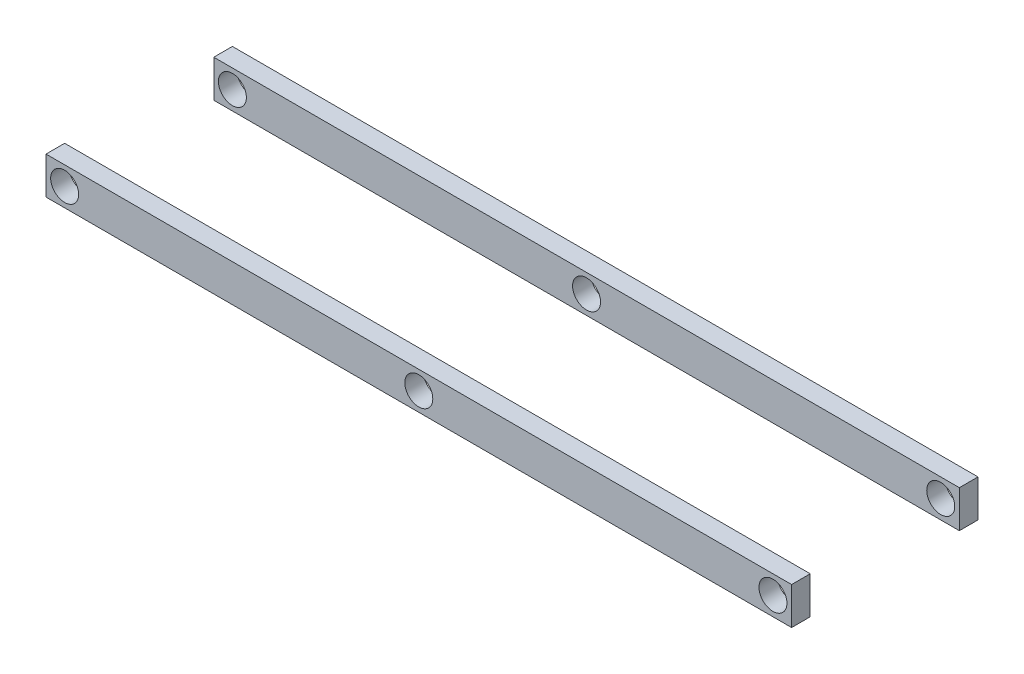
ISO-10303-21;
HEADER;
FILE_DESCRIPTION(('STEP AP214'),'2;1');
FILE_NAME('part.step','',(''),(''),'','','');
FILE_SCHEMA(('AUTOMOTIVE_DESIGN { 1 0 10303 214 1 1 1 1 }'));
ENDSEC;
DATA;
#1=APPLICATION_CONTEXT('core data for automotive mechanical design processes');
#2=APPLICATION_PROTOCOL_DEFINITION('international standard','automotive_design',2000,#1);
#3=PRODUCT_CONTEXT('',#1,'mechanical');
#4=PRODUCT('Part','Part','',(#3));
#5=PRODUCT_RELATED_PRODUCT_CATEGORY('part','',(#4));
#6=PRODUCT_DEFINITION_FORMATION('','',#4);
#7=PRODUCT_DEFINITION_CONTEXT('part definition',#1,'design');
#8=PRODUCT_DEFINITION('design','',#6,#7);
#9=PRODUCT_DEFINITION_SHAPE('','',#8);
#10=(LENGTH_UNIT() NAMED_UNIT(*) SI_UNIT(.MILLI.,.METRE.));
#11=(NAMED_UNIT(*) PLANE_ANGLE_UNIT() SI_UNIT($,.RADIAN.));
#12=(NAMED_UNIT(*) SI_UNIT($,.STERADIAN.) SOLID_ANGLE_UNIT());
#13=UNCERTAINTY_MEASURE_WITH_UNIT(LENGTH_MEASURE(1.E-05),#10,'distance_accuracy_value','');
#14=(GEOMETRIC_REPRESENTATION_CONTEXT(3) GLOBAL_UNCERTAINTY_ASSIGNED_CONTEXT((#13)) GLOBAL_UNIT_ASSIGNED_CONTEXT((#10,
#11,#12)) REPRESENTATION_CONTEXT('',''));
#15=CARTESIAN_POINT('',(0.,0.,0.));
#16=DIRECTION('',(0.,0.,1.));
#17=DIRECTION('',(1.,0.,0.));
#18=AXIS2_PLACEMENT_3D('',#15,#16,#17);
#19=CARTESIAN_POINT('',(0.,2.,0.));
#20=DIRECTION('',(1.,0.,0.));
#21=DIRECTION('',(0.,0.,-1.));
#22=AXIS2_PLACEMENT_3D('',#19,#20,#21);
#23=PLANE('',#22);
#24=DIRECTION('',(0.,0.,1.));
#25=VECTOR('',#24,1.);
#26=CARTESIAN_POINT('',(0.,0.,0.));
#27=LINE('',#26,#25);
#28=CARTESIAN_POINT('',(0.,0.,-10.));
#29=VERTEX_POINT('',#28);
#30=CARTESIAN_POINT('',(0.,0.,-9.));
#31=VERTEX_POINT('',#30);
#32=EDGE_CURVE('E116',#29,#31,#27,.T.);
#33=ORIENTED_EDGE('',*,*,#32,.T.);
#34=DIRECTION('',(0.,1.,0.));
#35=VECTOR('',#34,1.);
#36=CARTESIAN_POINT('',(0.,0.,-9.));
#37=LINE('',#36,#35);
#38=CARTESIAN_POINT('',(0.,2.,-9.));
#39=VERTEX_POINT('',#38);
#40=EDGE_CURVE('E115',#31,#39,#37,.T.);
#41=ORIENTED_EDGE('',*,*,#40,.T.);
#42=DIRECTION('',(0.,0.,1.));
#43=VECTOR('',#42,1.);
#44=CARTESIAN_POINT('',(0.,2.,0.));
#45=LINE('',#44,#43);
#46=CARTESIAN_POINT('',(0.,2.,-10.));
#47=VERTEX_POINT('',#46);
#48=EDGE_CURVE('E100',#47,#39,#45,.T.);
#49=ORIENTED_EDGE('',*,*,#48,.F.);
#50=DIRECTION('',(0.,-1.,0.));
#51=VECTOR('',#50,1.);
#52=CARTESIAN_POINT('',(0.,2.,-10.));
#53=LINE('',#52,#51);
#54=EDGE_CURVE('E106',#47,#29,#53,.T.);
#55=ORIENTED_EDGE('',*,*,#54,.T.);
#56=EDGE_LOOP('',(#33,#41,#49,#55));
#57=FACE_BOUND('',#56,.T.);
#58=ADVANCED_FACE('F49',(#57),#23,.F.);
#59=CARTESIAN_POINT('',(40.,2.,0.));
#60=DIRECTION('',(-1.,0.,0.));
#61=DIRECTION('',(0.,0.,1.));
#62=AXIS2_PLACEMENT_3D('',#59,#60,#61);
#63=PLANE('',#62);
#64=DIRECTION('',(0.,0.,-1.));
#65=VECTOR('',#64,1.);
#66=CARTESIAN_POINT('',(40.,2.,0.));
#67=LINE('',#66,#65);
#68=CARTESIAN_POINT('',(40.,2.,-9.));
#69=VERTEX_POINT('',#68);
#70=CARTESIAN_POINT('',(40.,2.,-10.));
#71=VERTEX_POINT('',#70);
#72=EDGE_CURVE('E95',#69,#71,#67,.T.);
#73=ORIENTED_EDGE('',*,*,#72,.F.);
#74=DIRECTION('',(0.,1.,0.));
#75=VECTOR('',#74,1.);
#76=CARTESIAN_POINT('',(40.,0.,-9.));
#77=LINE('',#76,#75);
#78=CARTESIAN_POINT('',(40.,0.,-9.));
#79=VERTEX_POINT('',#78);
#80=EDGE_CURVE('E12',#79,#69,#77,.T.);
#81=ORIENTED_EDGE('',*,*,#80,.F.);
#82=DIRECTION('',(0.,0.,-1.));
#83=VECTOR('',#82,1.);
#84=CARTESIAN_POINT('',(40.,0.,0.));
#85=LINE('',#84,#83);
#86=CARTESIAN_POINT('',(40.,0.,-10.));
#87=VERTEX_POINT('',#86);
#88=EDGE_CURVE('E91',#79,#87,#85,.T.);
#89=ORIENTED_EDGE('',*,*,#88,.T.);
#90=DIRECTION('',(0.,-1.,0.));
#91=VECTOR('',#90,1.);
#92=CARTESIAN_POINT('',(40.,2.,-10.));
#93=LINE('',#92,#91);
#94=EDGE_CURVE('E102',#71,#87,#93,.T.);
#95=ORIENTED_EDGE('',*,*,#94,.F.);
#96=EDGE_LOOP('',(#73,#81,#89,#95));
#97=FACE_BOUND('',#96,.T.);
#98=ADVANCED_FACE('F103',(#97),#63,.F.);
#99=CARTESIAN_POINT('',(0.,2.,0.));
#100=DIRECTION('',(0.,-1.,0.));
#101=DIRECTION('',(0.,0.,-1.));
#102=AXIS2_PLACEMENT_3D('',#99,#100,#101);
#103=PLANE('',#102);
#104=ORIENTED_EDGE('',*,*,#48,.T.);
#105=DIRECTION('',(-1.,0.,0.));
#106=VECTOR('',#105,1.);
#107=CARTESIAN_POINT('',(0.,2.,-9.));
#108=LINE('',#107,#106);
#109=EDGE_CURVE('E58',#69,#39,#108,.T.);
#110=ORIENTED_EDGE('',*,*,#109,.F.);
#111=ORIENTED_EDGE('',*,*,#72,.T.);
#112=DIRECTION('',(-1.,0.,0.));
#113=VECTOR('',#112,1.);
#114=CARTESIAN_POINT('',(0.,2.,-10.));
#115=LINE('',#114,#113);
#116=EDGE_CURVE('E99',#71,#47,#115,.T.);
#117=ORIENTED_EDGE('',*,*,#116,.T.);
#118=EDGE_LOOP('',(#104,#110,#111,#117));
#119=FACE_BOUND('',#118,.T.);
#120=ADVANCED_FACE('F97',(#119),#103,.F.);
#121=CARTESIAN_POINT('',(0.,0.,0.));
#122=DIRECTION('',(0.,-1.,0.));
#123=DIRECTION('',(0.,0.,-1.));
#124=AXIS2_PLACEMENT_3D('',#121,#122,#123);
#125=PLANE('',#124);
#126=DIRECTION('',(-1.,0.,0.));
#127=VECTOR('',#126,1.);
#128=CARTESIAN_POINT('',(0.,0.,-9.));
#129=LINE('',#128,#127);
#130=EDGE_CURVE('E108',#79,#31,#129,.T.);
#131=ORIENTED_EDGE('',*,*,#130,.T.);
#132=ORIENTED_EDGE('',*,*,#32,.F.);
#133=DIRECTION('',(-1.,0.,0.));
#134=VECTOR('',#133,1.);
#135=CARTESIAN_POINT('',(0.,0.,-10.));
#136=LINE('',#135,#134);
#137=EDGE_CURVE('E82',#87,#29,#136,.T.);
#138=ORIENTED_EDGE('',*,*,#137,.F.);
#139=ORIENTED_EDGE('',*,*,#88,.F.);
#140=EDGE_LOOP('',(#131,#132,#138,#139));
#141=FACE_BOUND('',#140,.T.);
#142=ADVANCED_FACE('F154',(#141),#125,.T.);
#143=CARTESIAN_POINT('',(0.,2.,-10.));
#144=DIRECTION('',(0.,0.,1.));
#145=DIRECTION('',(1.,0.,0.));
#146=AXIS2_PLACEMENT_3D('',#143,#144,#145);
#147=PLANE('',#146);
#148=CARTESIAN_POINT('',(20.,1.,-10.));
#149=DIRECTION('',(0.,0.,1.));
#150=DIRECTION('',(1.,0.,0.));
#151=AXIS2_PLACEMENT_3D('',#148,#149,#150);
#152=CIRCLE('',#151,0.750000000000002);
#153=CARTESIAN_POINT('',(20.75,1.,-10.));
#154=VERTEX_POINT('',#153);
#155=EDGE_CURVE('E126',#154,#154,#152,.T.);
#156=ORIENTED_EDGE('',*,*,#155,.T.);
#157=EDGE_LOOP('',(#156));
#158=FACE_BOUND('',#157,.T.);
#159=CARTESIAN_POINT('',(39.,1.,-10.));
#160=DIRECTION('',(0.,0.,1.));
#161=DIRECTION('',(1.,0.,0.));
#162=AXIS2_PLACEMENT_3D('',#159,#160,#161);
#163=CIRCLE('',#162,0.749999999999999);
#164=CARTESIAN_POINT('',(39.75,1.,-10.));
#165=VERTEX_POINT('',#164);
#166=EDGE_CURVE('E222',#165,#165,#163,.T.);
#167=ORIENTED_EDGE('',*,*,#166,.T.);
#168=EDGE_LOOP('',(#167));
#169=FACE_BOUND('',#168,.T.);
#170=CARTESIAN_POINT('',(1.,1.,-10.));
#171=DIRECTION('',(0.,0.,1.));
#172=DIRECTION('',(1.,0.,0.));
#173=AXIS2_PLACEMENT_3D('',#170,#171,#172);
#174=CIRCLE('',#173,0.75);
#175=CARTESIAN_POINT('',(1.75,1.,-10.));
#176=VERTEX_POINT('',#175);
#177=EDGE_CURVE('E225',#176,#176,#174,.T.);
#178=ORIENTED_EDGE('',*,*,#177,.T.);
#179=EDGE_LOOP('',(#178));
#180=FACE_BOUND('',#179,.T.);
#181=ORIENTED_EDGE('',*,*,#137,.T.);
#182=ORIENTED_EDGE('',*,*,#54,.F.);
#183=ORIENTED_EDGE('',*,*,#116,.F.);
#184=ORIENTED_EDGE('',*,*,#94,.T.);
#185=EDGE_LOOP('',(#181,#182,#183,#184));
#186=FACE_BOUND('',#185,.T.);
#187=ADVANCED_FACE('F105',(#158,#169,#180,#186),#147,.F.);
#188=CARTESIAN_POINT('',(0.,0.,-9.));
#189=DIRECTION('',(0.,0.,-1.));
#190=DIRECTION('',(-1.,0.,0.));
#191=AXIS2_PLACEMENT_3D('',#188,#189,#190);
#192=PLANE('',#191);
#193=CARTESIAN_POINT('',(20.,1.,-9.));
#194=DIRECTION('',(0.,0.,-1.));
#195=DIRECTION('',(-1.,0.,0.));
#196=AXIS2_PLACEMENT_3D('',#193,#194,#195);
#197=CIRCLE('',#196,0.750000000000002);
#198=CARTESIAN_POINT('',(19.25,1.,-9.));
#199=VERTEX_POINT('',#198);
#200=EDGE_CURVE('E52',#199,#199,#197,.T.);
#201=ORIENTED_EDGE('',*,*,#200,.T.);
#202=EDGE_LOOP('',(#201));
#203=FACE_BOUND('',#202,.T.);
#204=CARTESIAN_POINT('',(39.,1.,-9.));
#205=DIRECTION('',(0.,0.,-1.));
#206=DIRECTION('',(-1.,0.,0.));
#207=AXIS2_PLACEMENT_3D('',#204,#205,#206);
#208=CIRCLE('',#207,0.749999999999999);
#209=CARTESIAN_POINT('',(38.25,1.,-9.));
#210=VERTEX_POINT('',#209);
#211=EDGE_CURVE('E125',#210,#210,#208,.T.);
#212=ORIENTED_EDGE('',*,*,#211,.T.);
#213=EDGE_LOOP('',(#212));
#214=FACE_BOUND('',#213,.T.);
#215=CARTESIAN_POINT('',(1.,1.,-9.));
#216=DIRECTION('',(0.,0.,-1.));
#217=DIRECTION('',(-1.,0.,0.));
#218=AXIS2_PLACEMENT_3D('',#215,#216,#217);
#219=CIRCLE('',#218,0.75);
#220=CARTESIAN_POINT('',(0.25,1.,-9.));
#221=VERTEX_POINT('',#220);
#222=EDGE_CURVE('E123',#221,#221,#219,.T.);
#223=ORIENTED_EDGE('',*,*,#222,.T.);
#224=EDGE_LOOP('',(#223));
#225=FACE_BOUND('',#224,.T.);
#226=ORIENTED_EDGE('',*,*,#109,.T.);
#227=ORIENTED_EDGE('',*,*,#40,.F.);
#228=ORIENTED_EDGE('',*,*,#130,.F.);
#229=ORIENTED_EDGE('',*,*,#80,.T.);
#230=EDGE_LOOP('',(#226,#227,#228,#229));
#231=FACE_BOUND('',#230,.T.);
#232=ADVANCED_FACE('F133',(#203,#214,#225,#231),#192,.F.);
#233=CARTESIAN_POINT('',(1.,1.,-10.));
#234=DIRECTION('',(0.,0.,1.));
#235=DIRECTION('',(1.,0.,0.));
#236=AXIS2_PLACEMENT_3D('',#233,#234,#235);
#237=CYLINDRICAL_SURFACE('',#236,0.75);
#238=ORIENTED_EDGE('',*,*,#177,.F.);
#239=EDGE_LOOP('',(#238));
#240=FACE_BOUND('',#239,.T.);
#241=ORIENTED_EDGE('',*,*,#222,.F.);
#242=EDGE_LOOP('',(#241));
#243=FACE_BOUND('',#242,.T.);
#244=ADVANCED_FACE('F143',(#240,#243),#237,.F.);
#245=CARTESIAN_POINT('',(39.,1.,-10.));
#246=DIRECTION('',(0.,0.,1.));
#247=DIRECTION('',(1.,0.,0.));
#248=AXIS2_PLACEMENT_3D('',#245,#246,#247);
#249=CYLINDRICAL_SURFACE('',#248,0.749999999999999);
#250=ORIENTED_EDGE('',*,*,#166,.F.);
#251=EDGE_LOOP('',(#250));
#252=FACE_BOUND('',#251,.T.);
#253=ORIENTED_EDGE('',*,*,#211,.F.);
#254=EDGE_LOOP('',(#253));
#255=FACE_BOUND('',#254,.T.);
#256=ADVANCED_FACE('F137',(#252,#255),#249,.F.);
#257=CARTESIAN_POINT('',(20.,1.,-10.));
#258=DIRECTION('',(0.,0.,1.));
#259=DIRECTION('',(1.,0.,0.));
#260=AXIS2_PLACEMENT_3D('',#257,#258,#259);
#261=CYLINDRICAL_SURFACE('',#260,0.750000000000002);
#262=ORIENTED_EDGE('',*,*,#155,.F.);
#263=EDGE_LOOP('',(#262));
#264=FACE_BOUND('',#263,.T.);
#265=ORIENTED_EDGE('',*,*,#200,.F.);
#266=EDGE_LOOP('',(#265));
#267=FACE_BOUND('',#266,.T.);
#268=ADVANCED_FACE('F135',(#264,#267),#261,.F.);
#269=CLOSED_SHELL('',(#58,#98,#120,#142,#187,#232,#244,#256,#268));
#270=MANIFOLD_SOLID_BREP('B2',#269);
#271=CARTESIAN_POINT('',(0.,2.,0.));
#272=DIRECTION('',(0.,0.,-1.));
#273=DIRECTION('',(-1.,0.,0.));
#274=AXIS2_PLACEMENT_3D('',#271,#272,#273);
#275=PLANE('',#274);
#276=CARTESIAN_POINT('',(20.,1.,0.));
#277=DIRECTION('',(0.,0.,1.));
#278=DIRECTION('',(1.,0.,0.));
#279=AXIS2_PLACEMENT_3D('',#276,#277,#278);
#280=CIRCLE('',#279,0.750000000000002);
#281=CARTESIAN_POINT('',(20.75,1.,0.));
#282=VERTEX_POINT('',#281);
#283=EDGE_CURVE('E305',#282,#282,#280,.T.);
#284=ORIENTED_EDGE('',*,*,#283,.F.);
#285=EDGE_LOOP('',(#284));
#286=FACE_BOUND('',#285,.T.);
#287=CARTESIAN_POINT('',(39.,1.,0.));
#288=DIRECTION('',(0.,0.,1.));
#289=DIRECTION('',(1.,0.,0.));
#290=AXIS2_PLACEMENT_3D('',#287,#288,#289);
#291=CIRCLE('',#290,0.749999999999999);
#292=CARTESIAN_POINT('',(39.75,1.,0.));
#293=VERTEX_POINT('',#292);
#294=EDGE_CURVE('E384',#293,#293,#291,.T.);
#295=ORIENTED_EDGE('',*,*,#294,.F.);
#296=EDGE_LOOP('',(#295));
#297=FACE_BOUND('',#296,.T.);
#298=CARTESIAN_POINT('',(1.,1.,0.));
#299=DIRECTION('',(0.,0.,1.));
#300=DIRECTION('',(1.,0.,0.));
#301=AXIS2_PLACEMENT_3D('',#298,#299,#300);
#302=CIRCLE('',#301,0.75);
#303=CARTESIAN_POINT('',(1.75,1.,0.));
#304=VERTEX_POINT('',#303);
#305=EDGE_CURVE('E388',#304,#304,#302,.T.);
#306=ORIENTED_EDGE('',*,*,#305,.F.);
#307=EDGE_LOOP('',(#306));
#308=FACE_BOUND('',#307,.T.);
#309=DIRECTION('',(1.,0.,0.));
#310=VECTOR('',#309,1.);
#311=CARTESIAN_POINT('',(0.,0.,0.));
#312=LINE('',#311,#310);
#313=CARTESIAN_POINT('',(0.,0.,0.));
#314=VERTEX_POINT('',#313);
#315=CARTESIAN_POINT('',(40.,0.,0.));
#316=VERTEX_POINT('',#315);
#317=EDGE_CURVE('E275',#314,#316,#312,.T.);
#318=ORIENTED_EDGE('',*,*,#317,.T.);
#319=DIRECTION('',(0.,-1.,0.));
#320=VECTOR('',#319,1.);
#321=CARTESIAN_POINT('',(40.,2.,0.));
#322=LINE('',#321,#320);
#323=CARTESIAN_POINT('',(40.,2.,0.));
#324=VERTEX_POINT('',#323);
#325=EDGE_CURVE('E246',#324,#316,#322,.T.);
#326=ORIENTED_EDGE('',*,*,#325,.F.);
#327=DIRECTION('',(1.,0.,0.));
#328=VECTOR('',#327,1.);
#329=CARTESIAN_POINT('',(0.,2.,0.));
#330=LINE('',#329,#328);
#331=CARTESIAN_POINT('',(0.,2.,0.));
#332=VERTEX_POINT('',#331);
#333=EDGE_CURVE('E263',#332,#324,#330,.T.);
#334=ORIENTED_EDGE('',*,*,#333,.F.);
#335=DIRECTION('',(0.,-1.,0.));
#336=VECTOR('',#335,1.);
#337=CARTESIAN_POINT('',(0.,2.,0.));
#338=LINE('',#337,#336);
#339=EDGE_CURVE('E47',#332,#314,#338,.T.);
#340=ORIENTED_EDGE('',*,*,#339,.T.);
#341=EDGE_LOOP('',(#318,#326,#334,#340));
#342=FACE_BOUND('',#341,.T.);
#343=ADVANCED_FACE('F236',(#286,#297,#308,#342),#275,.F.);
#344=CARTESIAN_POINT('',(0.,2.,0.));
#345=DIRECTION('',(0.,-1.,0.));
#346=DIRECTION('',(0.,0.,-1.));
#347=AXIS2_PLACEMENT_3D('',#344,#345,#346);
#348=PLANE('',#347);
#349=DIRECTION('',(0.,0.,-1.));
#350=VECTOR('',#349,1.);
#351=CARTESIAN_POINT('',(40.,2.,0.));
#352=LINE('',#351,#350);
#353=CARTESIAN_POINT('',(40.,2.,-1.));
#354=VERTEX_POINT('',#353);
#355=EDGE_CURVE('E289',#324,#354,#352,.T.);
#356=ORIENTED_EDGE('',*,*,#355,.T.);
#357=DIRECTION('',(1.,0.,0.));
#358=VECTOR('',#357,1.);
#359=CARTESIAN_POINT('',(40.,2.,-1.));
#360=LINE('',#359,#358);
#361=CARTESIAN_POINT('',(0.,2.,-1.));
#362=VERTEX_POINT('',#361);
#363=EDGE_CURVE('E312',#362,#354,#360,.T.);
#364=ORIENTED_EDGE('',*,*,#363,.F.);
#365=DIRECTION('',(0.,0.,1.));
#366=VECTOR('',#365,1.);
#367=CARTESIAN_POINT('',(0.,2.,0.));
#368=LINE('',#367,#366);
#369=EDGE_CURVE('E295',#362,#332,#368,.T.);
#370=ORIENTED_EDGE('',*,*,#369,.T.);
#371=ORIENTED_EDGE('',*,*,#333,.T.);
#372=EDGE_LOOP('',(#356,#364,#370,#371));
#373=FACE_BOUND('',#372,.T.);
#374=ADVANCED_FACE('F340',(#373),#348,.F.);
#375=CARTESIAN_POINT('',(0.,0.,0.));
#376=DIRECTION('',(0.,-1.,0.));
#377=DIRECTION('',(0.,0.,-1.));
#378=AXIS2_PLACEMENT_3D('',#375,#376,#377);
#379=PLANE('',#378);
#380=DIRECTION('',(1.,0.,0.));
#381=VECTOR('',#380,1.);
#382=CARTESIAN_POINT('',(40.,0.,-1.));
#383=LINE('',#382,#381);
#384=CARTESIAN_POINT('',(0.,0.,-1.));
#385=VERTEX_POINT('',#384);
#386=CARTESIAN_POINT('',(40.,0.,-1.));
#387=VERTEX_POINT('',#386);
#388=EDGE_CURVE('E293',#385,#387,#383,.T.);
#389=ORIENTED_EDGE('',*,*,#388,.T.);
#390=DIRECTION('',(0.,0.,-1.));
#391=VECTOR('',#390,1.);
#392=CARTESIAN_POINT('',(40.,0.,0.));
#393=LINE('',#392,#391);
#394=EDGE_CURVE('E283',#316,#387,#393,.T.);
#395=ORIENTED_EDGE('',*,*,#394,.F.);
#396=ORIENTED_EDGE('',*,*,#317,.F.);
#397=DIRECTION('',(0.,0.,1.));
#398=VECTOR('',#397,1.);
#399=CARTESIAN_POINT('',(0.,0.,0.));
#400=LINE('',#399,#398);
#401=EDGE_CURVE('E284',#385,#314,#400,.T.);
#402=ORIENTED_EDGE('',*,*,#401,.F.);
#403=EDGE_LOOP('',(#389,#395,#396,#402));
#404=FACE_BOUND('',#403,.T.);
#405=ADVANCED_FACE('F292',(#404),#379,.T.);
#406=CARTESIAN_POINT('',(40.,2.,0.));
#407=DIRECTION('',(-1.,0.,0.));
#408=DIRECTION('',(0.,0.,1.));
#409=AXIS2_PLACEMENT_3D('',#406,#407,#408);
#410=PLANE('',#409);
#411=ORIENTED_EDGE('',*,*,#394,.T.);
#412=DIRECTION('',(0.,1.,0.));
#413=VECTOR('',#412,1.);
#414=CARTESIAN_POINT('',(40.,0.,-1.));
#415=LINE('',#414,#413);
#416=EDGE_CURVE('E254',#387,#354,#415,.T.);
#417=ORIENTED_EDGE('',*,*,#416,.T.);
#418=ORIENTED_EDGE('',*,*,#355,.F.);
#419=ORIENTED_EDGE('',*,*,#325,.T.);
#420=EDGE_LOOP('',(#411,#417,#418,#419));
#421=FACE_BOUND('',#420,.T.);
#422=ADVANCED_FACE('F288',(#421),#410,.F.);
#423=CARTESIAN_POINT('',(0.,2.,0.));
#424=DIRECTION('',(1.,0.,0.));
#425=DIRECTION('',(0.,0.,-1.));
#426=AXIS2_PLACEMENT_3D('',#423,#424,#425);
#427=PLANE('',#426);
#428=ORIENTED_EDGE('',*,*,#369,.F.);
#429=DIRECTION('',(0.,1.,0.));
#430=VECTOR('',#429,1.);
#431=CARTESIAN_POINT('',(0.,0.,-1.));
#432=LINE('',#431,#430);
#433=EDGE_CURVE('E321',#385,#362,#432,.T.);
#434=ORIENTED_EDGE('',*,*,#433,.F.);
#435=ORIENTED_EDGE('',*,*,#401,.T.);
#436=ORIENTED_EDGE('',*,*,#339,.F.);
#437=EDGE_LOOP('',(#428,#434,#435,#436));
#438=FACE_BOUND('',#437,.T.);
#439=ADVANCED_FACE('F238',(#438),#427,.F.);
#440=CARTESIAN_POINT('',(40.,0.,-1.));
#441=DIRECTION('',(0.,0.,1.));
#442=DIRECTION('',(1.,0.,0.));
#443=AXIS2_PLACEMENT_3D('',#440,#441,#442);
#444=PLANE('',#443);
#445=CARTESIAN_POINT('',(20.,1.,-1.));
#446=DIRECTION('',(0.,0.,1.));
#447=DIRECTION('',(1.,0.,0.));
#448=AXIS2_PLACEMENT_3D('',#445,#446,#447);
#449=CIRCLE('',#448,0.750000000000002);
#450=CARTESIAN_POINT('',(20.75,1.,-1.));
#451=VERTEX_POINT('',#450);
#452=EDGE_CURVE('E240',#451,#451,#449,.T.);
#453=ORIENTED_EDGE('',*,*,#452,.T.);
#454=EDGE_LOOP('',(#453));
#455=FACE_BOUND('',#454,.T.);
#456=CARTESIAN_POINT('',(39.,1.,-1.));
#457=DIRECTION('',(0.,0.,1.));
#458=DIRECTION('',(1.,0.,0.));
#459=AXIS2_PLACEMENT_3D('',#456,#457,#458);
#460=CIRCLE('',#459,0.749999999999999);
#461=CARTESIAN_POINT('',(39.75,1.,-1.));
#462=VERTEX_POINT('',#461);
#463=EDGE_CURVE('E304',#462,#462,#460,.T.);
#464=ORIENTED_EDGE('',*,*,#463,.T.);
#465=EDGE_LOOP('',(#464));
#466=FACE_BOUND('',#465,.T.);
#467=CARTESIAN_POINT('',(1.,1.,-1.));
#468=DIRECTION('',(0.,0.,1.));
#469=DIRECTION('',(1.,0.,0.));
#470=AXIS2_PLACEMENT_3D('',#467,#468,#469);
#471=CIRCLE('',#470,0.75);
#472=CARTESIAN_POINT('',(1.75,1.,-1.));
#473=VERTEX_POINT('',#472);
#474=EDGE_CURVE('E301',#473,#473,#471,.T.);
#475=ORIENTED_EDGE('',*,*,#474,.T.);
#476=EDGE_LOOP('',(#475));
#477=FACE_BOUND('',#476,.T.);
#478=ORIENTED_EDGE('',*,*,#363,.T.);
#479=ORIENTED_EDGE('',*,*,#416,.F.);
#480=ORIENTED_EDGE('',*,*,#388,.F.);
#481=ORIENTED_EDGE('',*,*,#433,.T.);
#482=EDGE_LOOP('',(#478,#479,#480,#481));
#483=FACE_BOUND('',#482,.T.);
#484=ADVANCED_FACE('F339',(#455,#466,#477,#483),#444,.F.);
#485=CARTESIAN_POINT('',(1.,1.,-10.));
#486=DIRECTION('',(0.,0.,1.));
#487=DIRECTION('',(1.,0.,0.));
#488=AXIS2_PLACEMENT_3D('',#485,#486,#487);
#489=CYLINDRICAL_SURFACE('',#488,0.75);
#490=ORIENTED_EDGE('',*,*,#305,.T.);
#491=EDGE_LOOP('',(#490));
#492=FACE_BOUND('',#491,.T.);
#493=ORIENTED_EDGE('',*,*,#474,.F.);
#494=EDGE_LOOP('',(#493));
#495=FACE_BOUND('',#494,.T.);
#496=ADVANCED_FACE('F359',(#492,#495),#489,.F.);
#497=CARTESIAN_POINT('',(39.,1.,-10.));
#498=DIRECTION('',(0.,0.,1.));
#499=DIRECTION('',(1.,0.,0.));
#500=AXIS2_PLACEMENT_3D('',#497,#498,#499);
#501=CYLINDRICAL_SURFACE('',#500,0.749999999999999);
#502=ORIENTED_EDGE('',*,*,#294,.T.);
#503=EDGE_LOOP('',(#502));
#504=FACE_BOUND('',#503,.T.);
#505=ORIENTED_EDGE('',*,*,#463,.F.);
#506=EDGE_LOOP('',(#505));
#507=FACE_BOUND('',#506,.T.);
#508=ADVANCED_FACE('F363',(#504,#507),#501,.F.);
#509=CARTESIAN_POINT('',(20.,1.,-10.));
#510=DIRECTION('',(0.,0.,1.));
#511=DIRECTION('',(1.,0.,0.));
#512=AXIS2_PLACEMENT_3D('',#509,#510,#511);
#513=CYLINDRICAL_SURFACE('',#512,0.750000000000002);
#514=ORIENTED_EDGE('',*,*,#283,.T.);
#515=EDGE_LOOP('',(#514));
#516=FACE_BOUND('',#515,.T.);
#517=ORIENTED_EDGE('',*,*,#452,.F.);
#518=EDGE_LOOP('',(#517));
#519=FACE_BOUND('',#518,.T.);
#520=ADVANCED_FACE('F371',(#516,#519),#513,.F.);
#521=CLOSED_SHELL('',(#343,#374,#405,#422,#439,#484,#496,#508,#520));
#522=MANIFOLD_SOLID_BREP('B6',#521);
#523=ADVANCED_BREP_SHAPE_REPRESENTATION('',(#18,#270,#522),#14);
#524=SHAPE_DEFINITION_REPRESENTATION(#9,#523);
ENDSEC;
END-ISO-10303-21;
